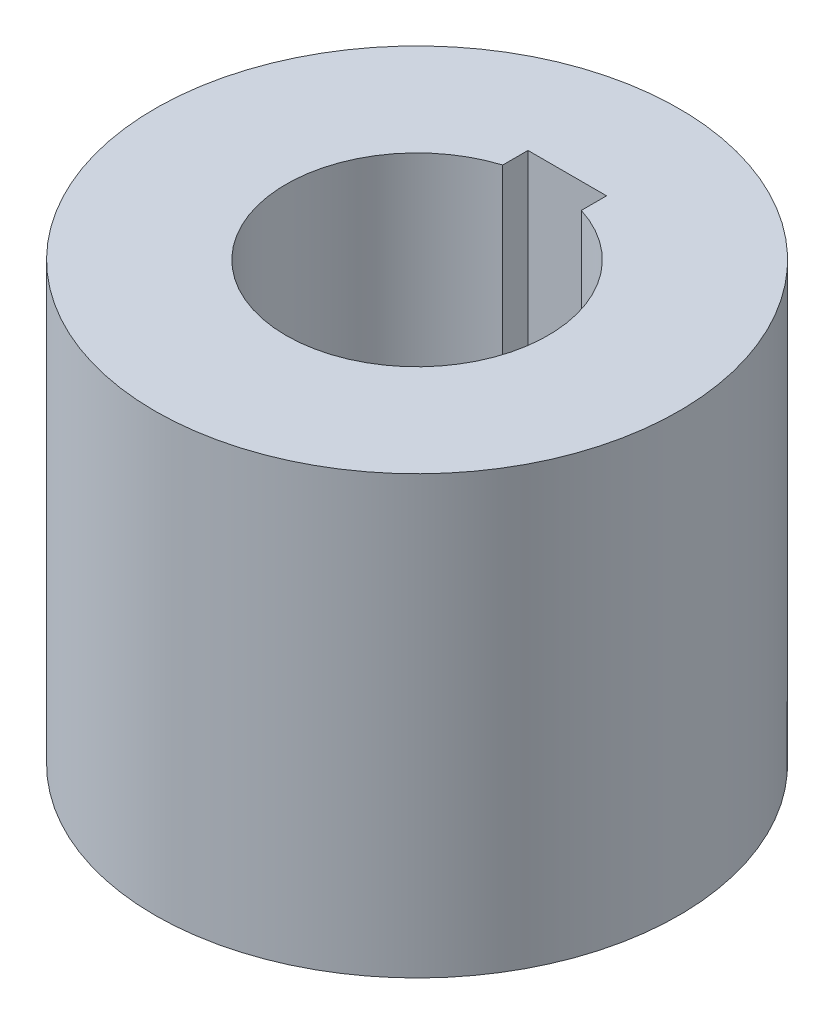
ISO-10303-21;
HEADER;
FILE_DESCRIPTION(('STEP AP214'),'2;1');
FILE_NAME('part.step','',(''),(''),'','','');
FILE_SCHEMA(('AUTOMOTIVE_DESIGN { 1 0 10303 214 1 1 1 1 }'));
ENDSEC;
DATA;
#1=APPLICATION_CONTEXT('core data for automotive mechanical design processes');
#2=APPLICATION_PROTOCOL_DEFINITION('international standard','automotive_design',2000,#1);
#3=PRODUCT_CONTEXT('',#1,'mechanical');
#4=PRODUCT('Part','Part','',(#3));
#5=PRODUCT_RELATED_PRODUCT_CATEGORY('part','',(#4));
#6=PRODUCT_DEFINITION_FORMATION('','',#4);
#7=PRODUCT_DEFINITION_CONTEXT('part definition',#1,'design');
#8=PRODUCT_DEFINITION('design','',#6,#7);
#9=PRODUCT_DEFINITION_SHAPE('','',#8);
#10=(LENGTH_UNIT() NAMED_UNIT(*) SI_UNIT(.MILLI.,.METRE.));
#11=(NAMED_UNIT(*) PLANE_ANGLE_UNIT() SI_UNIT($,.RADIAN.));
#12=(NAMED_UNIT(*) SI_UNIT($,.STERADIAN.) SOLID_ANGLE_UNIT());
#13=UNCERTAINTY_MEASURE_WITH_UNIT(LENGTH_MEASURE(1.E-05),#10,'distance_accuracy_value','');
#14=(GEOMETRIC_REPRESENTATION_CONTEXT(3) GLOBAL_UNCERTAINTY_ASSIGNED_CONTEXT((#13)) GLOBAL_UNIT_ASSIGNED_CONTEXT((#10,
#11,#12)) REPRESENTATION_CONTEXT('',''));
#15=CARTESIAN_POINT('',(0.,0.,0.));
#16=DIRECTION('',(0.,0.,1.));
#17=DIRECTION('',(1.,0.,0.));
#18=AXIS2_PLACEMENT_3D('',#15,#16,#17);
#19=CARTESIAN_POINT('',(0.,100.,0.));
#20=DIRECTION('',(0.,-1.,0.));
#21=DIRECTION('',(0.,0.,-1.));
#22=AXIS2_PLACEMENT_3D('',#19,#20,#21);
#23=CYLINDRICAL_SURFACE('',#22,60.);
#24=CARTESIAN_POINT('',(0.,100.,0.));
#25=DIRECTION('',(0.,1.,0.));
#26=DIRECTION('',(0.,0.,1.));
#27=AXIS2_PLACEMENT_3D('',#24,#25,#26);
#28=CIRCLE('',#27,60.);
#29=CARTESIAN_POINT('',(0.,100.,60.));
#30=VERTEX_POINT('',#29);
#31=EDGE_CURVE('E112',#30,#30,#28,.T.);
#32=ORIENTED_EDGE('',*,*,#31,.F.);
#33=EDGE_LOOP('',(#32));
#34=FACE_BOUND('',#33,.T.);
#35=CARTESIAN_POINT('',(0.,0.,0.));
#36=DIRECTION('',(0.,1.,0.));
#37=DIRECTION('',(0.,0.,1.));
#38=AXIS2_PLACEMENT_3D('',#35,#36,#37);
#39=CIRCLE('',#38,60.);
#40=CARTESIAN_POINT('',(0.,0.,60.));
#41=VERTEX_POINT('',#40);
#42=EDGE_CURVE('E109',#41,#41,#39,.T.);
#43=ORIENTED_EDGE('',*,*,#42,.T.);
#44=EDGE_LOOP('',(#43));
#45=FACE_BOUND('',#44,.T.);
#46=ADVANCED_FACE('F39',(#34,#45),#23,.T.);
#47=CARTESIAN_POINT('',(0.,100.,0.));
#48=DIRECTION('',(0.,1.,0.));
#49=DIRECTION('',(0.,0.,1.));
#50=AXIS2_PLACEMENT_3D('',#47,#48,#49);
#51=PLANE('',#50);
#52=DIRECTION('',(0.,0.,-1.));
#53=VECTOR('',#52,1.);
#54=CARTESIAN_POINT('',(8.99999999999998,100.,-34.4));
#55=LINE('',#54,#53);
#56=CARTESIAN_POINT('',(8.99999999999998,100.,-28.6181760425084));
#57=VERTEX_POINT('',#56);
#58=CARTESIAN_POINT('',(8.99999999999998,100.,-34.4));
#59=VERTEX_POINT('',#58);
#60=EDGE_CURVE('E82',#57,#59,#55,.T.);
#61=ORIENTED_EDGE('',*,*,#60,.F.);
#62=CARTESIAN_POINT('',(0.,100.,0.));
#63=DIRECTION('',(0.,1.,0.));
#64=DIRECTION('',(0.,0.,1.));
#65=AXIS2_PLACEMENT_3D('',#62,#63,#64);
#66=CIRCLE('',#65,30.);
#67=CARTESIAN_POINT('',(-9.00000000000002,100.,-28.6181760425084));
#68=VERTEX_POINT('',#67);
#69=EDGE_CURVE('E106',#68,#57,#66,.T.);
#70=ORIENTED_EDGE('',*,*,#69,.F.);
#71=DIRECTION('',(0.,0.,1.));
#72=VECTOR('',#71,1.);
#73=CARTESIAN_POINT('',(-9.00000000000002,100.,-34.4));
#74=LINE('',#73,#72);
#75=CARTESIAN_POINT('',(-9.00000000000002,100.,-34.4));
#76=VERTEX_POINT('',#75);
#77=EDGE_CURVE('E53',#76,#68,#74,.T.);
#78=ORIENTED_EDGE('',*,*,#77,.F.);
#79=DIRECTION('',(-1.,0.,0.));
#80=VECTOR('',#79,1.);
#81=CARTESIAN_POINT('',(-9.00000000000002,100.,-34.4));
#82=LINE('',#81,#80);
#83=EDGE_CURVE('E100',#59,#76,#82,.T.);
#84=ORIENTED_EDGE('',*,*,#83,.F.);
#85=EDGE_LOOP('',(#61,#70,#78,#84));
#86=FACE_BOUND('',#85,.T.);
#87=ORIENTED_EDGE('',*,*,#31,.T.);
#88=EDGE_LOOP('',(#87));
#89=FACE_BOUND('',#88,.T.);
#90=ADVANCED_FACE('F120',(#86,#89),#51,.T.);
#91=CARTESIAN_POINT('',(0.,0.,0.));
#92=DIRECTION('',(0.,1.,0.));
#93=DIRECTION('',(0.,0.,1.));
#94=AXIS2_PLACEMENT_3D('',#91,#92,#93);
#95=PLANE('',#94);
#96=CARTESIAN_POINT('',(0.,0.,0.));
#97=DIRECTION('',(0.,1.,0.));
#98=DIRECTION('',(0.,0.,1.));
#99=AXIS2_PLACEMENT_3D('',#96,#97,#98);
#100=CIRCLE('',#99,30.);
#101=CARTESIAN_POINT('',(-9.00000000000002,0.,-28.6181760425084));
#102=VERTEX_POINT('',#101);
#103=CARTESIAN_POINT('',(8.99999999999998,0.,-28.6181760425084));
#104=VERTEX_POINT('',#103);
#105=EDGE_CURVE('E98',#102,#104,#100,.T.);
#106=ORIENTED_EDGE('',*,*,#105,.T.);
#107=DIRECTION('',(0.,0.,-1.));
#108=VECTOR('',#107,1.);
#109=CARTESIAN_POINT('',(8.99999999999998,0.,-34.4));
#110=LINE('',#109,#108);
#111=CARTESIAN_POINT('',(8.99999999999998,0.,-34.4));
#112=VERTEX_POINT('',#111);
#113=EDGE_CURVE('E80',#104,#112,#110,.T.);
#114=ORIENTED_EDGE('',*,*,#113,.T.);
#115=DIRECTION('',(-1.,0.,0.));
#116=VECTOR('',#115,1.);
#117=CARTESIAN_POINT('',(-9.00000000000002,0.,-34.4));
#118=LINE('',#117,#116);
#119=CARTESIAN_POINT('',(-9.00000000000002,0.,-34.4));
#120=VERTEX_POINT('',#119);
#121=EDGE_CURVE('E90',#112,#120,#118,.T.);
#122=ORIENTED_EDGE('',*,*,#121,.T.);
#123=DIRECTION('',(0.,0.,1.));
#124=VECTOR('',#123,1.);
#125=CARTESIAN_POINT('',(-9.00000000000002,0.,-34.4));
#126=LINE('',#125,#124);
#127=EDGE_CURVE('E87',#120,#102,#126,.T.);
#128=ORIENTED_EDGE('',*,*,#127,.T.);
#129=EDGE_LOOP('',(#106,#114,#122,#128));
#130=FACE_BOUND('',#129,.T.);
#131=ORIENTED_EDGE('',*,*,#42,.F.);
#132=EDGE_LOOP('',(#131));
#133=FACE_BOUND('',#132,.T.);
#134=ADVANCED_FACE('F95',(#130,#133),#95,.F.);
#135=CARTESIAN_POINT('',(0.,0.,0.));
#136=DIRECTION('',(0.,1.,0.));
#137=DIRECTION('',(0.,0.,1.));
#138=AXIS2_PLACEMENT_3D('',#135,#136,#137);
#139=CYLINDRICAL_SURFACE('',#138,30.);
#140=ORIENTED_EDGE('',*,*,#69,.T.);
#141=DIRECTION('',(0.,1.,0.));
#142=VECTOR('',#141,1.);
#143=CARTESIAN_POINT('',(8.99999999999998,0.,-28.6181760425084));
#144=LINE('',#143,#142);
#145=EDGE_CURVE('E11',#57,#104,#144,.F.);
#146=ORIENTED_EDGE('',*,*,#145,.T.);
#147=ORIENTED_EDGE('',*,*,#105,.F.);
#148=DIRECTION('',(0.,1.,0.));
#149=VECTOR('',#148,1.);
#150=CARTESIAN_POINT('',(-9.00000000000002,0.,-28.6181760425084));
#151=LINE('',#150,#149);
#152=EDGE_CURVE('E46',#102,#68,#151,.T.);
#153=ORIENTED_EDGE('',*,*,#152,.T.);
#154=EDGE_LOOP('',(#140,#146,#147,#153));
#155=FACE_BOUND('',#154,.T.);
#156=ADVANCED_FACE('F118',(#155),#139,.F.);
#157=CARTESIAN_POINT('',(8.99999999999998,0.,-34.4));
#158=DIRECTION('',(1.,0.,0.));
#159=DIRECTION('',(0.,0.,-1.));
#160=AXIS2_PLACEMENT_3D('',#157,#158,#159);
#161=PLANE('',#160);
#162=ORIENTED_EDGE('',*,*,#60,.T.);
#163=DIRECTION('',(0.,1.,0.));
#164=VECTOR('',#163,1.);
#165=CARTESIAN_POINT('',(8.99999999999998,0.,-34.4));
#166=LINE('',#165,#164);
#167=EDGE_CURVE('E76',#112,#59,#166,.T.);
#168=ORIENTED_EDGE('',*,*,#167,.F.);
#169=ORIENTED_EDGE('',*,*,#113,.F.);
#170=ORIENTED_EDGE('',*,*,#145,.F.);
#171=EDGE_LOOP('',(#162,#168,#169,#170));
#172=FACE_BOUND('',#171,.T.);
#173=ADVANCED_FACE('F78',(#172),#161,.F.);
#174=CARTESIAN_POINT('',(-9.00000000000002,0.,-34.4));
#175=DIRECTION('',(-1.,0.,0.));
#176=DIRECTION('',(0.,0.,1.));
#177=AXIS2_PLACEMENT_3D('',#174,#175,#176);
#178=PLANE('',#177);
#179=ORIENTED_EDGE('',*,*,#127,.F.);
#180=DIRECTION('',(0.,1.,0.));
#181=VECTOR('',#180,1.);
#182=CARTESIAN_POINT('',(-9.00000000000002,0.,-34.4));
#183=LINE('',#182,#181);
#184=EDGE_CURVE('E86',#120,#76,#183,.T.);
#185=ORIENTED_EDGE('',*,*,#184,.T.);
#186=ORIENTED_EDGE('',*,*,#77,.T.);
#187=ORIENTED_EDGE('',*,*,#152,.F.);
#188=EDGE_LOOP('',(#179,#185,#186,#187));
#189=FACE_BOUND('',#188,.T.);
#190=ADVANCED_FACE('F137',(#189),#178,.F.);
#191=CARTESIAN_POINT('',(-9.00000000000002,0.,-34.4));
#192=DIRECTION('',(0.,0.,-1.));
#193=DIRECTION('',(-1.,0.,0.));
#194=AXIS2_PLACEMENT_3D('',#191,#192,#193);
#195=PLANE('',#194);
#196=ORIENTED_EDGE('',*,*,#83,.T.);
#197=ORIENTED_EDGE('',*,*,#184,.F.);
#198=ORIENTED_EDGE('',*,*,#121,.F.);
#199=ORIENTED_EDGE('',*,*,#167,.T.);
#200=EDGE_LOOP('',(#196,#197,#198,#199));
#201=FACE_BOUND('',#200,.T.);
#202=ADVANCED_FACE('F91',(#201),#195,.F.);
#203=CLOSED_SHELL('',(#46,#90,#134,#156,#173,#190,#202));
#204=MANIFOLD_SOLID_BREP('B2',#203);
#205=ADVANCED_BREP_SHAPE_REPRESENTATION('',(#18,#204),#14);
#206=SHAPE_DEFINITION_REPRESENTATION(#9,#205);
ENDSEC;
END-ISO-10303-21;
